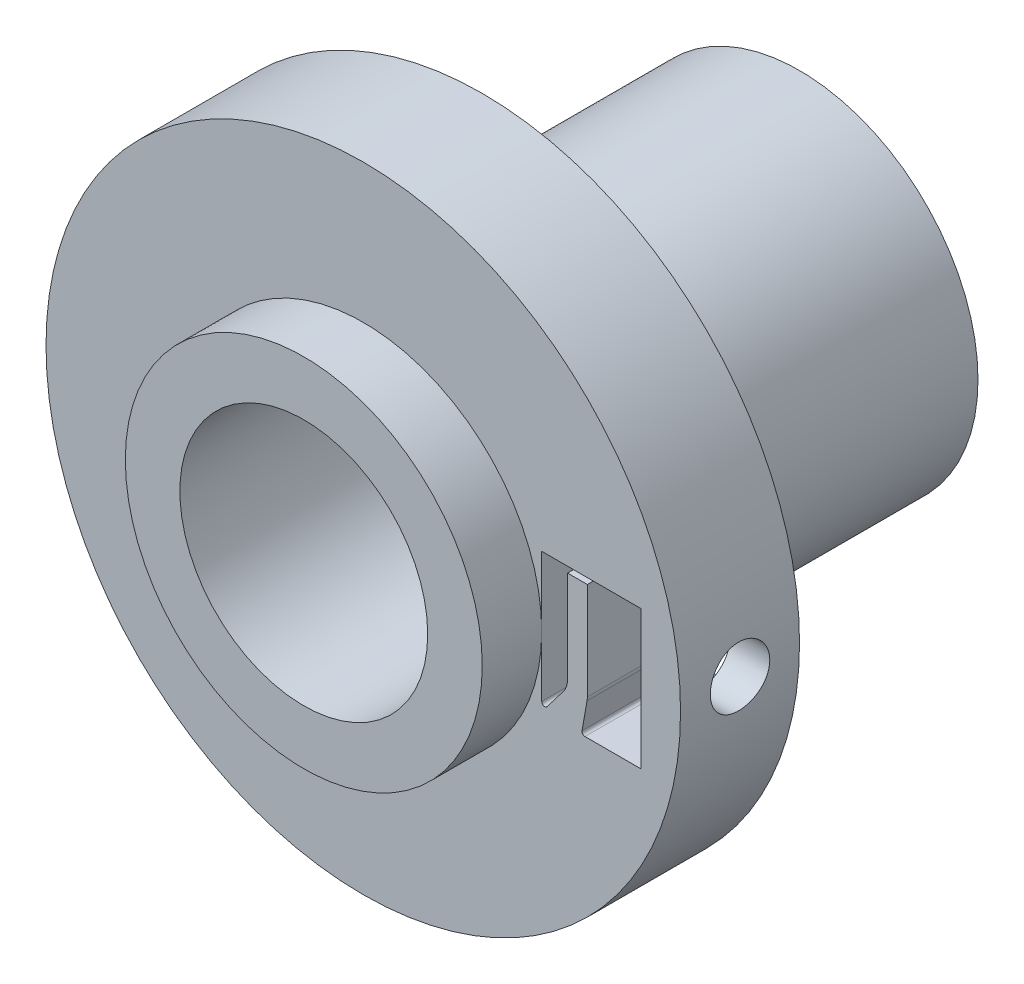
ISO-10303-21;
HEADER;
FILE_DESCRIPTION(('STEP AP214'),'2;1');
FILE_NAME('part.step','',(''),(''),'','','');
FILE_SCHEMA(('AUTOMOTIVE_DESIGN { 1 0 10303 214 1 1 1 1 }'));
ENDSEC;
DATA;
#1=APPLICATION_CONTEXT('core data for automotive mechanical design processes');
#2=APPLICATION_PROTOCOL_DEFINITION('international standard','automotive_design',2000,#1);
#3=PRODUCT_CONTEXT('',#1,'mechanical');
#4=PRODUCT('Part','Part','',(#3));
#5=PRODUCT_RELATED_PRODUCT_CATEGORY('part','',(#4));
#6=PRODUCT_DEFINITION_FORMATION('','',#4);
#7=PRODUCT_DEFINITION_CONTEXT('part definition',#1,'design');
#8=PRODUCT_DEFINITION('design','',#6,#7);
#9=PRODUCT_DEFINITION_SHAPE('','',#8);
#10=(LENGTH_UNIT() NAMED_UNIT(*) SI_UNIT(.MILLI.,.METRE.));
#11=(NAMED_UNIT(*) PLANE_ANGLE_UNIT() SI_UNIT($,.RADIAN.));
#12=(NAMED_UNIT(*) SI_UNIT($,.STERADIAN.) SOLID_ANGLE_UNIT());
#13=UNCERTAINTY_MEASURE_WITH_UNIT(LENGTH_MEASURE(1.E-05),#10,'distance_accuracy_value','');
#14=(GEOMETRIC_REPRESENTATION_CONTEXT(3) GLOBAL_UNCERTAINTY_ASSIGNED_CONTEXT((#13)) GLOBAL_UNIT_ASSIGNED_CONTEXT((#10,
#11,#12)) REPRESENTATION_CONTEXT('',''));
#15=CARTESIAN_POINT('',(0.,0.,0.));
#16=DIRECTION('',(0.,0.,1.));
#17=DIRECTION('',(1.,0.,0.));
#18=AXIS2_PLACEMENT_3D('',#15,#16,#17);
#19=CARTESIAN_POINT('',(0.,0.,-8.));
#20=DIRECTION('',(0.,0.,1.));
#21=DIRECTION('',(1.,0.,0.));
#22=AXIS2_PLACEMENT_3D('',#19,#20,#21);
#23=PLANE('',#22);
#24=CARTESIAN_POINT('',(0.,0.,-8.));
#25=DIRECTION('',(0.,0.,1.));
#26=DIRECTION('',(1.,0.,0.));
#27=AXIS2_PLACEMENT_3D('',#24,#25,#26);
#28=CIRCLE('',#27,9.);
#29=CARTESIAN_POINT('',(9.,0.,-8.));
#30=VERTEX_POINT('',#29);
#31=EDGE_CURVE('E246',#30,#30,#28,.T.);
#32=ORIENTED_EDGE('',*,*,#31,.F.);
#33=EDGE_LOOP('',(#32));
#34=FACE_BOUND('',#33,.T.);
#35=CARTESIAN_POINT('',(0.,0.,-8.));
#36=DIRECTION('',(0.,0.,1.));
#37=DIRECTION('',(1.,0.,0.));
#38=AXIS2_PLACEMENT_3D('',#35,#36,#37);
#39=CIRCLE('',#38,6.25);
#40=CARTESIAN_POINT('',(6.25,0.,-8.));
#41=VERTEX_POINT('',#40);
#42=EDGE_CURVE('E241',#41,#41,#39,.T.);
#43=ORIENTED_EDGE('',*,*,#42,.T.);
#44=EDGE_LOOP('',(#43));
#45=FACE_BOUND('',#44,.T.);
#46=ADVANCED_FACE('F33',(#34,#45),#23,.F.);
#47=CARTESIAN_POINT('',(0.,0.,8.));
#48=DIRECTION('',(0.,0.,-1.));
#49=DIRECTION('',(-1.,0.,0.));
#50=AXIS2_PLACEMENT_3D('',#47,#48,#49);
#51=CYLINDRICAL_SURFACE('',#50,9.);
#52=CARTESIAN_POINT('',(0.,0.,8.));
#53=DIRECTION('',(0.,0.,1.));
#54=DIRECTION('',(1.,0.,0.));
#55=AXIS2_PLACEMENT_3D('',#52,#53,#54);
#56=CIRCLE('',#55,9.);
#57=CARTESIAN_POINT('',(9.,0.,8.));
#58=VERTEX_POINT('',#57);
#59=EDGE_CURVE('E247',#58,#58,#56,.T.);
#60=ORIENTED_EDGE('',*,*,#59,.F.);
#61=EDGE_LOOP('',(#60));
#62=FACE_BOUND('',#61,.T.);
#63=ORIENTED_EDGE('',*,*,#31,.T.);
#64=EDGE_LOOP('',(#63));
#65=FACE_BOUND('',#64,.T.);
#66=ADVANCED_FACE('F294',(#62,#65),#51,.T.);
#67=CARTESIAN_POINT('',(0.,0.,8.));
#68=DIRECTION('',(0.,0.,-1.));
#69=DIRECTION('',(-1.,0.,0.));
#70=AXIS2_PLACEMENT_3D('',#67,#68,#69);
#71=CYLINDRICAL_SURFACE('',#70,6.25);
#72=ORIENTED_EDGE('',*,*,#42,.F.);
#73=EDGE_LOOP('',(#72));
#74=FACE_BOUND('',#73,.T.);
#75=CARTESIAN_POINT('',(0.,0.,17.));
#76=DIRECTION('',(0.,0.,1.));
#77=DIRECTION('',(1.,0.,0.));
#78=AXIS2_PLACEMENT_3D('',#75,#76,#77);
#79=CIRCLE('',#78,6.25);
#80=CARTESIAN_POINT('',(6.25,0.,17.));
#81=VERTEX_POINT('',#80);
#82=EDGE_CURVE('E371',#81,#81,#79,.T.);
#83=ORIENTED_EDGE('',*,*,#82,.T.);
#84=EDGE_LOOP('',(#83));
#85=FACE_BOUND('',#84,.T.);
#86=ADVANCED_FACE('F300',(#74,#85),#71,.F.);
#87=CARTESIAN_POINT('',(0.,0.,14.));
#88=DIRECTION('',(0.,0.,1.));
#89=DIRECTION('',(1.,0.,0.));
#90=AXIS2_PLACEMENT_3D('',#87,#88,#89);
#91=PLANE('',#90);
#92=DIRECTION('',(-0.607450107570798,-0.794357832977196,0.));
#93=VECTOR('',#92,1.);
#94=CARTESIAN_POINT('',(9.,-3.5,14.));
#95=LINE('',#94,#93);
#96=CARTESIAN_POINT('',(10.0943578329772,-2.0689166799529,14.));
#97=VERTEX_POINT('',#96);
#98=CARTESIAN_POINT('',(9.26915367494658,-3.14802980968524,14.));
#99=VERTEX_POINT('',#98);
#100=EDGE_CURVE('E191',#97,#99,#95,.T.);
#101=ORIENTED_EDGE('',*,*,#100,.T.);
#102=CARTESIAN_POINT('',(9.15,-3.05691229354962,14.));
#103=DIRECTION('',(0.,0.,1.));
#104=DIRECTION('',(1.,0.,0.));
#105=AXIS2_PLACEMENT_3D('',#102,#103,#104);
#106=CIRCLE('',#105,0.15);
#107=CARTESIAN_POINT('',(9.,-3.05691229354962,14.));
#108=VERTEX_POINT('',#107);
#109=EDGE_CURVE('E142',#99,#108,#106,.F.);
#110=ORIENTED_EDGE('',*,*,#109,.T.);
#111=DIRECTION('',(0.,1.,0.));
#112=VECTOR('',#111,1.);
#113=CARTESIAN_POINT('',(9.,3.5,14.));
#114=LINE('',#113,#112);
#115=CARTESIAN_POINT('',(9.,0.,14.));
#116=VERTEX_POINT('',#115);
#117=EDGE_CURVE('E134',#108,#116,#114,.T.);
#118=ORIENTED_EDGE('',*,*,#117,.T.);
#119=CARTESIAN_POINT('',(0.,0.,14.));
#120=DIRECTION('',(0.,0.,1.));
#121=DIRECTION('',(1.,0.,0.));
#122=AXIS2_PLACEMENT_3D('',#119,#120,#121);
#123=CIRCLE('',#122,9.);
#124=EDGE_CURVE('E140',#116,#116,#123,.T.);
#125=ORIENTED_EDGE('',*,*,#124,.F.);
#126=CARTESIAN_POINT('',(9.,3.5,14.));
#127=VERTEX_POINT('',#126);
#128=EDGE_CURVE('E147',#116,#127,#114,.T.);
#129=ORIENTED_EDGE('',*,*,#128,.T.);
#130=DIRECTION('',(1.,0.,0.));
#131=VECTOR('',#130,1.);
#132=CARTESIAN_POINT('',(14.,3.5,14.));
#133=LINE('',#132,#131);
#134=CARTESIAN_POINT('',(14.,3.5,14.));
#135=VERTEX_POINT('',#134);
#136=EDGE_CURVE('E146',#127,#135,#133,.T.);
#137=ORIENTED_EDGE('',*,*,#136,.T.);
#138=DIRECTION('',(0.,-1.,0.));
#139=VECTOR('',#138,1.);
#140=CARTESIAN_POINT('',(14.,3.5,14.));
#141=LINE('',#140,#139);
#142=CARTESIAN_POINT('',(14.,-3.5,14.));
#143=VERTEX_POINT('',#142);
#144=EDGE_CURVE('E169',#135,#143,#141,.T.);
#145=ORIENTED_EDGE('',*,*,#144,.T.);
#146=DIRECTION('',(-1.,0.,0.));
#147=VECTOR('',#146,1.);
#148=CARTESIAN_POINT('',(14.,-3.5,14.));
#149=LINE('',#148,#147);
#150=CARTESIAN_POINT('',(11.1787883220732,-3.5,14.));
#151=VERTEX_POINT('',#150);
#152=EDGE_CURVE('E172',#143,#151,#149,.T.);
#153=ORIENTED_EDGE('',*,*,#152,.T.);
#154=CARTESIAN_POINT('',(11.1787883220732,-3.35,14.));
#155=DIRECTION('',(0.,0.,1.));
#156=DIRECTION('',(1.,0.,0.));
#157=AXIS2_PLACEMENT_3D('',#154,#155,#156);
#158=CIRCLE('',#157,0.15);
#159=CARTESIAN_POINT('',(11.0310707882505,-3.32393219991364,14.));
#160=VERTEX_POINT('',#159);
#161=EDGE_CURVE('E11',#151,#160,#158,.F.);
#162=ORIENTED_EDGE('',*,*,#161,.T.);
#163=DIRECTION('',(0.173785333909048,0.984783558817937,0.));
#164=VECTOR('',#163,1.);
#165=CARTESIAN_POINT('',(11.2847835588179,-1.8862265000317,14.));
#166=LINE('',#165,#164);
#167=CARTESIAN_POINT('',(11.2847835588179,-1.8862265000317,14.));
#168=VERTEX_POINT('',#167);
#169=EDGE_CURVE('E174',#160,#168,#166,.T.);
#170=ORIENTED_EDGE('',*,*,#169,.T.);
#171=CARTESIAN_POINT('',(10.3,-1.71244116612265,14.));
#172=DIRECTION('',(0.,0.,1.));
#173=DIRECTION('',(-1.,0.,0.));
#174=AXIS2_PLACEMENT_3D('',#171,#172,#173);
#175=CIRCLE('',#174,0.999999999999999);
#176=CARTESIAN_POINT('',(11.3,-1.71244116612265,14.));
#177=VERTEX_POINT('',#176);
#178=EDGE_CURVE('E176',#168,#177,#175,.T.);
#179=ORIENTED_EDGE('',*,*,#178,.T.);
#180=DIRECTION('',(0.,1.,0.));
#181=VECTOR('',#180,1.);
#182=CARTESIAN_POINT('',(11.3,3.20000000000001,14.));
#183=LINE('',#182,#181);
#184=CARTESIAN_POINT('',(11.3,3.20000000000001,14.));
#185=VERTEX_POINT('',#184);
#186=EDGE_CURVE('E179',#177,#185,#183,.T.);
#187=ORIENTED_EDGE('',*,*,#186,.T.);
#188=DIRECTION('',(-1.,0.,0.));
#189=VECTOR('',#188,1.);
#190=CARTESIAN_POINT('',(10.3,3.20000000000001,14.));
#191=LINE('',#190,#189);
#192=CARTESIAN_POINT('',(10.3,3.20000000000001,14.));
#193=VERTEX_POINT('',#192);
#194=EDGE_CURVE('E182',#185,#193,#191,.T.);
#195=ORIENTED_EDGE('',*,*,#194,.T.);
#196=DIRECTION('',(0.,-1.,0.));
#197=VECTOR('',#196,1.);
#198=CARTESIAN_POINT('',(10.3,-1.4614665723821,14.));
#199=LINE('',#198,#197);
#200=CARTESIAN_POINT('',(10.3,-1.4614665723821,14.));
#201=VERTEX_POINT('',#200);
#202=EDGE_CURVE('E185',#193,#201,#199,.T.);
#203=ORIENTED_EDGE('',*,*,#202,.T.);
#204=CARTESIAN_POINT('',(9.3,-1.4614665723821,14.));
#205=DIRECTION('',(0.,0.,-1.));
#206=DIRECTION('',(1.,0.,0.));
#207=AXIS2_PLACEMENT_3D('',#204,#205,#206);
#208=CIRCLE('',#207,1.);
#209=EDGE_CURVE('E188',#201,#97,#208,.T.);
#210=ORIENTED_EDGE('',*,*,#209,.T.);
#211=EDGE_LOOP('',(#101,#110,#118,#125,#129,#137,#145,#153,#162,#170,#179,#187,#195,#203,#210));
#212=FACE_BOUND('',#211,.T.);
#213=CARTESIAN_POINT('',(0.,0.,14.));
#214=DIRECTION('',(0.,0.,1.));
#215=DIRECTION('',(1.,0.,0.));
#216=AXIS2_PLACEMENT_3D('',#213,#214,#215);
#217=CIRCLE('',#216,16.);
#218=CARTESIAN_POINT('',(16.,0.,14.));
#219=VERTEX_POINT('',#218);
#220=EDGE_CURVE('E238',#219,#219,#217,.T.);
#221=ORIENTED_EDGE('',*,*,#220,.T.);
#222=EDGE_LOOP('',(#221));
#223=FACE_BOUND('',#222,.T.);
#224=ADVANCED_FACE('F137',(#212,#223),#91,.T.);
#225=CARTESIAN_POINT('',(0.,0.,8.));
#226=DIRECTION('',(0.,0.,1.));
#227=DIRECTION('',(1.,0.,0.));
#228=AXIS2_PLACEMENT_3D('',#225,#226,#227);
#229=PLANE('',#228);
#230=DIRECTION('',(1.,0.,0.));
#231=VECTOR('',#230,1.);
#232=CARTESIAN_POINT('',(14.,3.5,8.));
#233=LINE('',#232,#231);
#234=CARTESIAN_POINT('',(9.,3.5,8.));
#235=VERTEX_POINT('',#234);
#236=CARTESIAN_POINT('',(14.,3.5,8.));
#237=VERTEX_POINT('',#236);
#238=EDGE_CURVE('E195',#235,#237,#233,.T.);
#239=ORIENTED_EDGE('',*,*,#238,.F.);
#240=DIRECTION('',(0.,-1.,0.));
#241=VECTOR('',#240,1.);
#242=CARTESIAN_POINT('',(9.,0.,8.));
#243=LINE('',#242,#241);
#244=EDGE_CURVE('E250',#235,#58,#243,.T.);
#245=ORIENTED_EDGE('',*,*,#244,.T.);
#246=ORIENTED_EDGE('',*,*,#59,.T.);
#247=DIRECTION('',(0.,1.,0.));
#248=VECTOR('',#247,1.);
#249=CARTESIAN_POINT('',(9.,3.5,8.));
#250=LINE('',#249,#248);
#251=CARTESIAN_POINT('',(9.,-3.05691229354962,8.));
#252=VERTEX_POINT('',#251);
#253=EDGE_CURVE('E193',#252,#58,#250,.T.);
#254=ORIENTED_EDGE('',*,*,#253,.F.);
#255=CARTESIAN_POINT('',(9.15,-3.05691229354962,8.));
#256=DIRECTION('',(0.,0.,1.));
#257=DIRECTION('',(1.,0.,0.));
#258=AXIS2_PLACEMENT_3D('',#255,#256,#257);
#259=CIRCLE('',#258,0.15);
#260=CARTESIAN_POINT('',(9.26915367494658,-3.14802980968524,8.));
#261=VERTEX_POINT('',#260);
#262=EDGE_CURVE('E263',#252,#261,#259,.T.);
#263=ORIENTED_EDGE('',*,*,#262,.T.);
#264=DIRECTION('',(-0.607450107570798,-0.794357832977196,0.));
#265=VECTOR('',#264,1.);
#266=CARTESIAN_POINT('',(9.,-3.5,8.));
#267=LINE('',#266,#265);
#268=CARTESIAN_POINT('',(10.0943578329772,-2.0689166799529,8.));
#269=VERTEX_POINT('',#268);
#270=EDGE_CURVE('E155',#269,#261,#267,.T.);
#271=ORIENTED_EDGE('',*,*,#270,.F.);
#272=CARTESIAN_POINT('',(9.3,-1.4614665723821,8.));
#273=DIRECTION('',(0.,0.,-1.));
#274=DIRECTION('',(1.,0.,0.));
#275=AXIS2_PLACEMENT_3D('',#272,#273,#274);
#276=CIRCLE('',#275,1.);
#277=CARTESIAN_POINT('',(10.3,-1.4614665723821,8.));
#278=VERTEX_POINT('',#277);
#279=EDGE_CURVE('E157',#278,#269,#276,.T.);
#280=ORIENTED_EDGE('',*,*,#279,.F.);
#281=DIRECTION('',(0.,-1.,0.));
#282=VECTOR('',#281,1.);
#283=CARTESIAN_POINT('',(10.3,-1.4614665723821,8.));
#284=LINE('',#283,#282);
#285=CARTESIAN_POINT('',(10.3,3.20000000000001,8.));
#286=VERTEX_POINT('',#285);
#287=EDGE_CURVE('E214',#286,#278,#284,.T.);
#288=ORIENTED_EDGE('',*,*,#287,.F.);
#289=DIRECTION('',(-1.,0.,0.));
#290=VECTOR('',#289,1.);
#291=CARTESIAN_POINT('',(10.3,3.20000000000001,8.));
#292=LINE('',#291,#290);
#293=CARTESIAN_POINT('',(11.3,3.20000000000001,8.));
#294=VERTEX_POINT('',#293);
#295=EDGE_CURVE('E211',#294,#286,#292,.T.);
#296=ORIENTED_EDGE('',*,*,#295,.F.);
#297=DIRECTION('',(0.,1.,0.));
#298=VECTOR('',#297,1.);
#299=CARTESIAN_POINT('',(11.3,3.20000000000001,8.));
#300=LINE('',#299,#298);
#301=CARTESIAN_POINT('',(11.3,-1.71244116612265,8.));
#302=VERTEX_POINT('',#301);
#303=EDGE_CURVE('E208',#302,#294,#300,.T.);
#304=ORIENTED_EDGE('',*,*,#303,.F.);
#305=CARTESIAN_POINT('',(10.3,-1.71244116612265,8.));
#306=DIRECTION('',(0.,0.,1.));
#307=DIRECTION('',(-1.,0.,0.));
#308=AXIS2_PLACEMENT_3D('',#305,#306,#307);
#309=CIRCLE('',#308,0.999999999999999);
#310=CARTESIAN_POINT('',(11.2847835588179,-1.8862265000317,8.));
#311=VERTEX_POINT('',#310);
#312=EDGE_CURVE('E205',#311,#302,#309,.T.);
#313=ORIENTED_EDGE('',*,*,#312,.F.);
#314=DIRECTION('',(0.173785333909048,0.984783558817937,0.));
#315=VECTOR('',#314,1.);
#316=CARTESIAN_POINT('',(11.2847835588179,-1.8862265000317,8.));
#317=LINE('',#316,#315);
#318=CARTESIAN_POINT('',(11.0310707882505,-3.32393219991364,8.));
#319=VERTEX_POINT('',#318);
#320=EDGE_CURVE('E203',#319,#311,#317,.T.);
#321=ORIENTED_EDGE('',*,*,#320,.F.);
#322=CARTESIAN_POINT('',(11.1787883220732,-3.35,8.));
#323=DIRECTION('',(0.,0.,1.));
#324=DIRECTION('',(1.,0.,0.));
#325=AXIS2_PLACEMENT_3D('',#322,#323,#324);
#326=CIRCLE('',#325,0.15);
#327=CARTESIAN_POINT('',(11.1787883220732,-3.5,8.));
#328=VERTEX_POINT('',#327);
#329=EDGE_CURVE('E41',#319,#328,#326,.T.);
#330=ORIENTED_EDGE('',*,*,#329,.T.);
#331=DIRECTION('',(-1.,0.,0.));
#332=VECTOR('',#331,1.);
#333=CARTESIAN_POINT('',(14.,-3.5,8.));
#334=LINE('',#333,#332);
#335=CARTESIAN_POINT('',(14.,-3.5,8.));
#336=VERTEX_POINT('',#335);
#337=EDGE_CURVE('E201',#336,#328,#334,.T.);
#338=ORIENTED_EDGE('',*,*,#337,.F.);
#339=DIRECTION('',(0.,-1.,0.));
#340=VECTOR('',#339,1.);
#341=CARTESIAN_POINT('',(14.,3.5,8.));
#342=LINE('',#341,#340);
#343=EDGE_CURVE('E198',#237,#336,#342,.T.);
#344=ORIENTED_EDGE('',*,*,#343,.F.);
#345=EDGE_LOOP('',(#239,#245,#246,#254,#263,#271,#280,#288,#296,#304,#313,#321,#330,#338,#344));
#346=FACE_BOUND('',#345,.T.);
#347=CARTESIAN_POINT('',(0.,0.,8.));
#348=DIRECTION('',(0.,0.,1.));
#349=DIRECTION('',(1.,0.,0.));
#350=AXIS2_PLACEMENT_3D('',#347,#348,#349);
#351=CIRCLE('',#350,16.);
#352=CARTESIAN_POINT('',(16.,0.,8.));
#353=VERTEX_POINT('',#352);
#354=EDGE_CURVE('E221',#353,#353,#351,.T.);
#355=ORIENTED_EDGE('',*,*,#354,.F.);
#356=EDGE_LOOP('',(#355));
#357=FACE_BOUND('',#356,.T.);
#358=ADVANCED_FACE('F278',(#346,#357),#229,.F.);
#359=CARTESIAN_POINT('',(0.,0.,14.));
#360=DIRECTION('',(0.,0.,-1.));
#361=DIRECTION('',(-1.,0.,0.));
#362=AXIS2_PLACEMENT_3D('',#359,#360,#361);
#363=CYLINDRICAL_SURFACE('',#362,16.);
#364=CARTESIAN_POINT('',(16.,0.,9.49999999999999));
#365=CARTESIAN_POINT('',(15.9999990874377,-0.0840576996574436,9.50000365297454));
#366=CARTESIAN_POINT('',(15.9993305431474,-0.168171627589379,9.50708947712899));
#367=CARTESIAN_POINT('',(15.9967278705616,-0.334069380755584,9.53525029986667));
#368=CARTESIAN_POINT('',(15.9947923323258,-0.41585050405935,9.5563408836487));
#369=CARTESIAN_POINT('',(15.9898742536092,-0.574656127608676,9.61189348015233));
#370=CARTESIAN_POINT('',(15.9868923297887,-0.65168339804474,9.64634761866461));
#371=CARTESIAN_POINT('',(15.9802152971296,-0.798844080486045,9.72763447702507));
#372=CARTESIAN_POINT('',(15.9765203343939,-0.868978900331676,9.77446466172327));
#373=CARTESIAN_POINT('',(15.9688182603974,-1.00060451358299,9.87933459825466));
#374=CARTESIAN_POINT('',(15.9648102960756,-1.06207030524922,9.93740567079617));
#375=CARTESIAN_POINT('',(15.9569410358395,-1.17439832001845,10.0630423573301));
#376=CARTESIAN_POINT('',(15.9530797465779,-1.22526006263066,10.1306084013267));
#377=CARTESIAN_POINT('',(15.9459321531903,-1.31502335742932,10.2734717482233));
#378=CARTESIAN_POINT('',(15.9426469303983,-1.35390251855919,10.348783178514));
#379=CARTESIAN_POINT('',(15.9370337331836,-1.41845402355083,10.5049013311272));
#380=CARTESIAN_POINT('',(15.9347057377932,-1.44412665669788,10.5857079330355));
#381=CARTESIAN_POINT('',(15.9312781055131,-1.48146280171703,10.7502691883138));
#382=CARTESIAN_POINT('',(15.9301748556596,-1.49316752621389,10.8340144147356));
#383=CARTESIAN_POINT('',(15.9293103424401,-1.50236296529023,11.0022874652902));
#384=CARTESIAN_POINT('',(15.9295490478042,-1.49985401107327,11.0868152711418));
#385=CARTESIAN_POINT('',(15.9313381803757,-1.48072731632193,11.2539706157215));
#386=CARTESIAN_POINT('',(15.9328844316596,-1.46415449112824,11.3366033448381));
#387=CARTESIAN_POINT('',(15.9371079001961,-1.41744034122964,11.497909220756));
#388=CARTESIAN_POINT('',(15.9397851310565,-1.3872988532664,11.5765823199022));
#389=CARTESIAN_POINT('',(15.9459737103685,-1.3142531244971,11.727878077872));
#390=CARTESIAN_POINT('',(15.9494863652322,-1.27132886758545,11.8004910172943));
#391=CARTESIAN_POINT('',(15.9569488633928,-1.17395046357292,11.9374989115113));
#392=CARTESIAN_POINT('',(15.9608987179246,-1.11949602014408,12.0018936550287));
#393=CARTESIAN_POINT('',(15.9688091656293,-1.0003517239972,12.1208982908966));
#394=CARTESIAN_POINT('',(15.9727697411833,-0.935623065481643,12.1754693406234));
#395=CARTESIAN_POINT('',(15.980240887844,-0.797902747560454,12.2729767493523));
#396=CARTESIAN_POINT('',(15.9837514585342,-0.724911080506019,12.3159130975843));
#397=CARTESIAN_POINT('',(15.9899280035071,-0.572710457840158,12.388930399422));
#398=CARTESIAN_POINT('',(15.9925938548147,-0.493500599071183,12.4190094814773));
#399=CARTESIAN_POINT('',(15.9967792828423,-0.331124322273424,12.4654304536089));
#400=CARTESIAN_POINT('',(15.9982988896806,-0.247958008264099,12.4817727046306));
#401=CARTESIAN_POINT('',(16.0000167439267,-0.0803661051891794,12.5002070701882));
#402=CARTESIAN_POINT('',(16.0002199632847,0.00405353705355381,12.5023528051343));
#403=CARTESIAN_POINT('',(15.9992954563897,0.17205127843741,12.4924739167253));
#404=CARTESIAN_POINT('',(15.9981677459063,0.255629387537639,12.4804494612663));
#405=CARTESIAN_POINT('',(15.9947113308173,0.419417565662278,12.4426159901192));
#406=CARTESIAN_POINT('',(15.9923848051808,0.499633460781155,12.4168319808046));
#407=CARTESIAN_POINT('',(15.9867919001555,0.654601026064808,12.3522369510549));
#408=CARTESIAN_POINT('',(15.9835255021299,0.72935258783897,12.3134256722958));
#409=CARTESIAN_POINT('',(15.9764061412804,0.871512627170615,12.2237441338324));
#410=CARTESIAN_POINT('',(15.9725514712721,0.938898720136997,12.1728385285295));
#411=CARTESIAN_POINT('',(15.9646938863657,1.06418863953513,12.0604641893156));
#412=CARTESIAN_POINT('',(15.9606909682048,1.12209225711382,11.998995222806));
#413=CARTESIAN_POINT('',(15.9529731744665,1.22695884240091,11.8670055812055));
#414=CARTESIAN_POINT('',(15.9492592480101,1.27388669789138,11.7964569459727));
#415=CARTESIAN_POINT('',(15.9425540145368,1.35522852111171,11.6484489904856));
#416=CARTESIAN_POINT('',(15.9395626986821,1.38964264189422,11.5709897547677));
#417=CARTESIAN_POINT('',(15.9346470864828,1.44492091464444,11.411481345012));
#418=CARTESIAN_POINT('',(15.9327211269093,1.46580619653948,11.3294395470036));
#419=CARTESIAN_POINT('',(15.9301489811257,1.49350258954047,11.1629947213508));
#420=CARTESIAN_POINT('',(15.9295027630406,1.50031405119065,11.0785917525705));
#421=CARTESIAN_POINT('',(15.929563861851,1.49966491440228,10.9101694388341));
#422=CARTESIAN_POINT('',(15.930265947437,1.49225947642594,10.8261498739104));
#423=CARTESIAN_POINT('',(15.9329334080922,1.46350215815381,10.6605537598966));
#424=CARTESIAN_POINT('',(15.9348987847997,1.44215025977346,10.5789772139744));
#425=CARTESIAN_POINT('',(15.9398699587172,1.38612086380733,10.4205816575547));
#426=CARTESIAN_POINT('',(15.9428756482903,1.35144474478351,10.3437621558342));
#427=CARTESIAN_POINT('',(15.9495889947787,1.26975707915473,10.1970253859609));
#428=CARTESIAN_POINT('',(15.9532966449687,1.22274565072801,10.127108051691));
#429=CARTESIAN_POINT('',(15.9610133498176,1.1175144922873,9.9958776803139));
#430=CARTESIAN_POINT('',(15.9650234741094,1.05925372920377,9.93459760928345));
#431=CARTESIAN_POINT('',(15.97288349636,0.933256833294971,9.82265816583139));
#432=CARTESIAN_POINT('',(15.9767333555577,0.865518425328444,9.77200135087676));
#433=CARTESIAN_POINT('',(15.9838478838907,0.72232503234334,9.68265914281074));
#434=CARTESIAN_POINT('',(15.9871112141985,0.646852995234789,9.64400099570282));
#435=CARTESIAN_POINT('',(15.9926700583075,0.490507906890441,9.57995682073443));
#436=CARTESIAN_POINT('',(15.9949666711945,0.409641110987893,9.55455571267651));
#437=CARTESIAN_POINT('',(15.997751278192,0.27359062604344,9.52413424804104));
#438=CARTESIAN_POINT('',(15.9985906537126,0.219278798513778,9.5150961367273));
#439=CARTESIAN_POINT('',(15.9997153122197,0.109986004796567,9.5030278280725));
#440=CARTESIAN_POINT('',(16.0000005971556,0.0550050409638891,9.49999760959417));
#441=CARTESIAN_POINT('',(16.,0.,9.49999999999999));
#442=B_SPLINE_CURVE_WITH_KNOTS('',3,(#364,#365,#366,#367,#368,#369,#370,#371,#372,#373,#374,
#375,#376,#377,#378,#379,#380,#381,#382,#383,#384,#385,#386,#387,#388,#389,#390,#391,#392,#393,
#394,#395,#396,#397,#398,#399,#400,#401,#402,#403,#404,#405,#406,#407,#408,#409,#410,#411,#412,
#413,#414,#415,#416,#417,#418,#419,#420,#421,#422,#423,#424,#425,#426,#427,#428,#429,#430,#431,
#432,#433,#434,#435,#436,#437,#438,#439,#440,#441),.UNSPECIFIED.,.T.,.F.,(4,2,2,2,2,2,2,2,2,2,2,
2,2,2,2,2,2,2,2,2,2,2,2,2,2,2,2,2,2,2,2,2,2,2,2,2,2,2,4),(0.,0.251972252870636,
0.504225384091021,0.756330105411321,1.00838322474624,1.26114902549997,1.51392627709208,
1.7671730523228,2.02041428001783,2.27290645171287,2.52539273992279,2.77707569221288,
3.02876167283652,3.28084385105098,3.53293250861135,3.78599701442564,4.03906175449558,
4.29216331905138,4.54525823296865,4.79739665595727,5.04953209150326,5.30121085328535,
5.55289460601788,5.80532315252836,6.05775725807136,6.31098819719603,6.5642160390067,
6.81704741885483,7.06987250121942,7.32171862414044,7.57356507363442,7.82538547338787,
8.0772034606682,8.32995794997955,8.58277321830876,8.83615843702519,9.08925479233283,
9.25413906717823,9.41902276191881),.UNSPECIFIED.);
#443=CARTESIAN_POINT('',(16.,0.,9.49999999999999));
#444=VERTEX_POINT('',#443);
#445=EDGE_CURVE('E161',#444,#444,#442,.T.);
#446=ORIENTED_EDGE('',*,*,#445,.T.);
#447=EDGE_LOOP('',(#446));
#448=FACE_BOUND('',#447,.T.);
#449=ORIENTED_EDGE('',*,*,#220,.F.);
#450=EDGE_LOOP('',(#449));
#451=FACE_BOUND('',#450,.T.);
#452=ORIENTED_EDGE('',*,*,#354,.T.);
#453=EDGE_LOOP('',(#452));
#454=FACE_BOUND('',#453,.T.);
#455=ADVANCED_FACE('F308',(#448,#451,#454),#363,.T.);
#456=CARTESIAN_POINT('',(9.,3.5,14.));
#457=DIRECTION('',(-1.,0.,0.));
#458=DIRECTION('',(0.,-1.,0.));
#459=AXIS2_PLACEMENT_3D('',#456,#457,#458);
#460=PLANE('',#459);
#461=ORIENTED_EDGE('',*,*,#117,.F.);
#462=DIRECTION('',(0.,0.,-1.));
#463=VECTOR('',#462,1.);
#464=CARTESIAN_POINT('',(9.,-3.05691229354962,8.));
#465=LINE('',#464,#463);
#466=EDGE_CURVE('E255',#108,#252,#465,.T.);
#467=ORIENTED_EDGE('',*,*,#466,.T.);
#468=ORIENTED_EDGE('',*,*,#253,.T.);
#469=ORIENTED_EDGE('',*,*,#244,.F.);
#470=DIRECTION('',(0.,0.,-1.));
#471=VECTOR('',#470,1.);
#472=CARTESIAN_POINT('',(9.,3.5,14.));
#473=LINE('',#472,#471);
#474=EDGE_CURVE('E152',#127,#235,#473,.T.);
#475=ORIENTED_EDGE('',*,*,#474,.F.);
#476=ORIENTED_EDGE('',*,*,#128,.F.);
#477=EDGE_LOOP('',(#461,#467,#468,#469,#475,#476));
#478=FACE_BOUND('',#477,.T.);
#479=ADVANCED_FACE('F150',(#478),#460,.F.);
#480=CARTESIAN_POINT('',(9.,-3.5,14.));
#481=DIRECTION('',(0.794357832977196,-0.607450107570798,0.));
#482=DIRECTION('',(0.607450107570798,0.794357832977196,0.));
#483=AXIS2_PLACEMENT_3D('',#480,#481,#482);
#484=PLANE('',#483);
#485=ORIENTED_EDGE('',*,*,#270,.T.);
#486=DIRECTION('',(0.,0.,-1.));
#487=VECTOR('',#486,1.);
#488=CARTESIAN_POINT('',(9.26915367494658,-3.14802980968524,14.));
#489=LINE('',#488,#487);
#490=EDGE_CURVE('E261',#261,#99,#489,.F.);
#491=ORIENTED_EDGE('',*,*,#490,.T.);
#492=ORIENTED_EDGE('',*,*,#100,.F.);
#493=DIRECTION('',(0.,0.,-1.));
#494=VECTOR('',#493,1.);
#495=CARTESIAN_POINT('',(10.0943578329772,-2.0689166799529,14.));
#496=LINE('',#495,#494);
#497=EDGE_CURVE('E219',#97,#269,#496,.T.);
#498=ORIENTED_EDGE('',*,*,#497,.T.);
#499=EDGE_LOOP('',(#485,#491,#492,#498));
#500=FACE_BOUND('',#499,.T.);
#501=ADVANCED_FACE('F319',(#500),#484,.F.);
#502=CARTESIAN_POINT('',(9.3,-1.4614665723821,14.));
#503=DIRECTION('',(0.,0.,-1.));
#504=DIRECTION('',(-1.,0.,0.));
#505=AXIS2_PLACEMENT_3D('',#502,#503,#504);
#506=CYLINDRICAL_SURFACE('',#505,1.);
#507=ORIENTED_EDGE('',*,*,#279,.T.);
#508=ORIENTED_EDGE('',*,*,#497,.F.);
#509=ORIENTED_EDGE('',*,*,#209,.F.);
#510=DIRECTION('',(0.,0.,-1.));
#511=VECTOR('',#510,1.);
#512=CARTESIAN_POINT('',(10.3,-1.4614665723821,14.));
#513=LINE('',#512,#511);
#514=EDGE_CURVE('E222',#201,#278,#513,.T.);
#515=ORIENTED_EDGE('',*,*,#514,.T.);
#516=EDGE_LOOP('',(#507,#508,#509,#515));
#517=FACE_BOUND('',#516,.T.);
#518=ADVANCED_FACE('F347',(#517),#506,.F.);
#519=CARTESIAN_POINT('',(10.3,-1.4614665723821,14.));
#520=DIRECTION('',(1.,0.,0.));
#521=DIRECTION('',(0.,1.,0.));
#522=AXIS2_PLACEMENT_3D('',#519,#520,#521);
#523=PLANE('',#522);
#524=ORIENTED_EDGE('',*,*,#287,.T.);
#525=ORIENTED_EDGE('',*,*,#514,.F.);
#526=ORIENTED_EDGE('',*,*,#202,.F.);
#527=DIRECTION('',(0.,0.,-1.));
#528=VECTOR('',#527,1.);
#529=CARTESIAN_POINT('',(10.3,3.20000000000001,14.));
#530=LINE('',#529,#528);
#531=EDGE_CURVE('E224',#193,#286,#530,.T.);
#532=ORIENTED_EDGE('',*,*,#531,.T.);
#533=EDGE_LOOP('',(#524,#525,#526,#532));
#534=FACE_BOUND('',#533,.T.);
#535=ADVANCED_FACE('F343',(#534),#523,.F.);
#536=CARTESIAN_POINT('',(10.3,3.20000000000001,14.));
#537=DIRECTION('',(0.,-1.,0.));
#538=DIRECTION('',(0.,0.,-1.));
#539=AXIS2_PLACEMENT_3D('',#536,#537,#538);
#540=PLANE('',#539);
#541=ORIENTED_EDGE('',*,*,#295,.T.);
#542=ORIENTED_EDGE('',*,*,#531,.F.);
#543=ORIENTED_EDGE('',*,*,#194,.F.);
#544=DIRECTION('',(0.,0.,-1.));
#545=VECTOR('',#544,1.);
#546=CARTESIAN_POINT('',(11.3,3.20000000000001,14.));
#547=LINE('',#546,#545);
#548=EDGE_CURVE('E226',#185,#294,#547,.T.);
#549=ORIENTED_EDGE('',*,*,#548,.T.);
#550=EDGE_LOOP('',(#541,#542,#543,#549));
#551=FACE_BOUND('',#550,.T.);
#552=ADVANCED_FACE('F339',(#551),#540,.F.);
#553=CARTESIAN_POINT('',(11.3,3.20000000000001,14.));
#554=DIRECTION('',(-1.,0.,0.));
#555=DIRECTION('',(0.,-1.,0.));
#556=AXIS2_PLACEMENT_3D('',#553,#554,#555);
#557=PLANE('',#556);
#558=ORIENTED_EDGE('',*,*,#303,.T.);
#559=ORIENTED_EDGE('',*,*,#548,.F.);
#560=ORIENTED_EDGE('',*,*,#186,.F.);
#561=DIRECTION('',(0.,0.,-1.));
#562=VECTOR('',#561,1.);
#563=CARTESIAN_POINT('',(11.3,-1.71244116612265,14.));
#564=LINE('',#563,#562);
#565=EDGE_CURVE('E228',#177,#302,#564,.T.);
#566=ORIENTED_EDGE('',*,*,#565,.T.);
#567=EDGE_LOOP('',(#558,#559,#560,#566));
#568=FACE_BOUND('',#567,.T.);
#569=ADVANCED_FACE('F336',(#568),#557,.F.);
#570=CARTESIAN_POINT('',(10.3,-1.71244116612265,14.));
#571=DIRECTION('',(0.,0.,-1.));
#572=DIRECTION('',(-1.,0.,0.));
#573=AXIS2_PLACEMENT_3D('',#570,#571,#572);
#574=CYLINDRICAL_SURFACE('',#573,0.999999999999999);
#575=ORIENTED_EDGE('',*,*,#312,.T.);
#576=ORIENTED_EDGE('',*,*,#565,.F.);
#577=ORIENTED_EDGE('',*,*,#178,.F.);
#578=DIRECTION('',(0.,0.,-1.));
#579=VECTOR('',#578,1.);
#580=CARTESIAN_POINT('',(11.2847835588179,-1.8862265000317,14.));
#581=LINE('',#580,#579);
#582=EDGE_CURVE('E230',#168,#311,#581,.T.);
#583=ORIENTED_EDGE('',*,*,#582,.T.);
#584=EDGE_LOOP('',(#575,#576,#577,#583));
#585=FACE_BOUND('',#584,.T.);
#586=ADVANCED_FACE('F283',(#585),#574,.T.);
#587=CARTESIAN_POINT('',(11.2847835588179,-1.8862265000317,14.));
#588=DIRECTION('',(-0.984783558817937,0.173785333909048,0.));
#589=DIRECTION('',(-0.173785333909048,-0.984783558817937,0.));
#590=AXIS2_PLACEMENT_3D('',#587,#588,#589);
#591=PLANE('',#590);
#592=ORIENTED_EDGE('',*,*,#169,.F.);
#593=DIRECTION('',(0.,0.,-1.));
#594=VECTOR('',#593,1.);
#595=CARTESIAN_POINT('',(11.0310707882505,-3.32393219991364,8.));
#596=LINE('',#595,#594);
#597=EDGE_CURVE('E266',#160,#319,#596,.T.);
#598=ORIENTED_EDGE('',*,*,#597,.T.);
#599=ORIENTED_EDGE('',*,*,#320,.T.);
#600=ORIENTED_EDGE('',*,*,#582,.F.);
#601=EDGE_LOOP('',(#592,#598,#599,#600));
#602=FACE_BOUND('',#601,.T.);
#603=ADVANCED_FACE('F272',(#602),#591,.F.);
#604=CARTESIAN_POINT('',(14.,-3.5,14.));
#605=DIRECTION('',(0.,-1.,0.));
#606=DIRECTION('',(0.,0.,-1.));
#607=AXIS2_PLACEMENT_3D('',#604,#605,#606);
#608=PLANE('',#607);
#609=ORIENTED_EDGE('',*,*,#337,.T.);
#610=DIRECTION('',(0.,0.,-1.));
#611=VECTOR('',#610,1.);
#612=CARTESIAN_POINT('',(11.1787883220732,-3.5,14.));
#613=LINE('',#612,#611);
#614=EDGE_CURVE('E48',#328,#151,#613,.F.);
#615=ORIENTED_EDGE('',*,*,#614,.T.);
#616=ORIENTED_EDGE('',*,*,#152,.F.);
#617=DIRECTION('',(0.,0.,-1.));
#618=VECTOR('',#617,1.);
#619=CARTESIAN_POINT('',(14.,-3.5,14.));
#620=LINE('',#619,#618);
#621=EDGE_CURVE('E233',#143,#336,#620,.T.);
#622=ORIENTED_EDGE('',*,*,#621,.T.);
#623=EDGE_LOOP('',(#609,#615,#616,#622));
#624=FACE_BOUND('',#623,.T.);
#625=ADVANCED_FACE('F328',(#624),#608,.F.);
#626=CARTESIAN_POINT('',(14.,3.5,14.));
#627=DIRECTION('',(1.,0.,0.));
#628=DIRECTION('',(0.,0.,-1.));
#629=AXIS2_PLACEMENT_3D('',#626,#627,#628);
#630=PLANE('',#629);
#631=CARTESIAN_POINT('',(14.,0.,11.));
#632=DIRECTION('',(1.,0.,0.));
#633=DIRECTION('',(0.,0.,-1.));
#634=AXIS2_PLACEMENT_3D('',#631,#632,#633);
#635=CIRCLE('',#634,1.5);
#636=CARTESIAN_POINT('',(14.,0.,9.49999999999999));
#637=VERTEX_POINT('',#636);
#638=EDGE_CURVE('E256',#637,#637,#635,.T.);
#639=ORIENTED_EDGE('',*,*,#638,.T.);
#640=EDGE_LOOP('',(#639));
#641=FACE_BOUND('',#640,.T.);
#642=ORIENTED_EDGE('',*,*,#343,.T.);
#643=ORIENTED_EDGE('',*,*,#621,.F.);
#644=ORIENTED_EDGE('',*,*,#144,.F.);
#645=DIRECTION('',(0.,0.,-1.));
#646=VECTOR('',#645,1.);
#647=CARTESIAN_POINT('',(14.,3.5,14.));
#648=LINE('',#647,#646);
#649=EDGE_CURVE('E235',#135,#237,#648,.T.);
#650=ORIENTED_EDGE('',*,*,#649,.T.);
#651=EDGE_LOOP('',(#642,#643,#644,#650));
#652=FACE_BOUND('',#651,.T.);
#653=ADVANCED_FACE('F324',(#641,#652),#630,.F.);
#654=CARTESIAN_POINT('',(14.,3.5,14.));
#655=DIRECTION('',(0.,1.,0.));
#656=DIRECTION('',(-1.,0.,0.));
#657=AXIS2_PLACEMENT_3D('',#654,#655,#656);
#658=PLANE('',#657);
#659=ORIENTED_EDGE('',*,*,#238,.T.);
#660=ORIENTED_EDGE('',*,*,#649,.F.);
#661=ORIENTED_EDGE('',*,*,#136,.F.);
#662=ORIENTED_EDGE('',*,*,#474,.T.);
#663=EDGE_LOOP('',(#659,#660,#661,#662));
#664=FACE_BOUND('',#663,.T.);
#665=ADVANCED_FACE('F320',(#664),#658,.F.);
#666=CARTESIAN_POINT('',(13.,0.,11.));
#667=DIRECTION('',(1.,0.,0.));
#668=DIRECTION('',(0.,0.,-1.));
#669=AXIS2_PLACEMENT_3D('',#666,#667,#668);
#670=CYLINDRICAL_SURFACE('',#669,1.5);
#671=ORIENTED_EDGE('',*,*,#638,.F.);
#672=EDGE_LOOP('',(#671));
#673=FACE_BOUND('',#672,.T.);
#674=ORIENTED_EDGE('',*,*,#445,.F.);
#675=EDGE_LOOP('',(#674));
#676=FACE_BOUND('',#675,.T.);
#677=ADVANCED_FACE('F323',(#673,#676),#670,.F.);
#678=CARTESIAN_POINT('',(0.,0.,17.));
#679=DIRECTION('',(0.,0.,1.));
#680=DIRECTION('',(1.,0.,0.));
#681=AXIS2_PLACEMENT_3D('',#678,#679,#680);
#682=PLANE('',#681);
#683=CARTESIAN_POINT('',(0.,0.,17.));
#684=DIRECTION('',(0.,0.,1.));
#685=DIRECTION('',(1.,0.,0.));
#686=AXIS2_PLACEMENT_3D('',#683,#684,#685);
#687=CIRCLE('',#686,9.);
#688=CARTESIAN_POINT('',(9.,0.,17.));
#689=VERTEX_POINT('',#688);
#690=EDGE_CURVE('E259',#689,#689,#687,.T.);
#691=ORIENTED_EDGE('',*,*,#690,.T.);
#692=EDGE_LOOP('',(#691));
#693=FACE_BOUND('',#692,.T.);
#694=ORIENTED_EDGE('',*,*,#82,.F.);
#695=EDGE_LOOP('',(#694));
#696=FACE_BOUND('',#695,.T.);
#697=ADVANCED_FACE('F357',(#693,#696),#682,.T.);
#698=CARTESIAN_POINT('',(0.,0.,17.));
#699=DIRECTION('',(0.,0.,-1.));
#700=DIRECTION('',(-1.,0.,0.));
#701=AXIS2_PLACEMENT_3D('',#698,#699,#700);
#702=CYLINDRICAL_SURFACE('',#701,9.);
#703=ORIENTED_EDGE('',*,*,#690,.F.);
#704=EDGE_LOOP('',(#703));
#705=FACE_BOUND('',#704,.T.);
#706=ORIENTED_EDGE('',*,*,#124,.T.);
#707=EDGE_LOOP('',(#706));
#708=FACE_BOUND('',#707,.T.);
#709=ADVANCED_FACE('F291',(#705,#708),#702,.T.);
#710=CARTESIAN_POINT('',(9.15,-3.05691229354962,14.));
#711=DIRECTION('',(0.,0.,1.));
#712=DIRECTION('',(1.,0.,0.));
#713=AXIS2_PLACEMENT_3D('',#710,#711,#712);
#714=CYLINDRICAL_SURFACE('',#713,0.15);
#715=ORIENTED_EDGE('',*,*,#109,.F.);
#716=ORIENTED_EDGE('',*,*,#490,.F.);
#717=ORIENTED_EDGE('',*,*,#262,.F.);
#718=ORIENTED_EDGE('',*,*,#466,.F.);
#719=EDGE_LOOP('',(#715,#716,#717,#718));
#720=FACE_BOUND('',#719,.T.);
#721=ADVANCED_FACE('F287',(#720),#714,.F.);
#722=CARTESIAN_POINT('',(11.1787883220732,-3.35,14.));
#723=DIRECTION('',(0.,0.,1.));
#724=DIRECTION('',(1.,0.,0.));
#725=AXIS2_PLACEMENT_3D('',#722,#723,#724);
#726=CYLINDRICAL_SURFACE('',#725,0.15);
#727=ORIENTED_EDGE('',*,*,#161,.F.);
#728=ORIENTED_EDGE('',*,*,#614,.F.);
#729=ORIENTED_EDGE('',*,*,#329,.F.);
#730=ORIENTED_EDGE('',*,*,#597,.F.);
#731=EDGE_LOOP('',(#727,#728,#729,#730));
#732=FACE_BOUND('',#731,.T.);
#733=ADVANCED_FACE('F35',(#732),#726,.F.);
#734=CLOSED_SHELL('',(#46,#66,#86,#224,#358,#455,#479,#501,#518,#535,#552,#569,#586,#603,#625,
#653,#665,#677,#697,#709,#721,#733));
#735=MANIFOLD_SOLID_BREP('B2',#734);
#736=ADVANCED_BREP_SHAPE_REPRESENTATION('',(#18,#735),#14);
#737=SHAPE_DEFINITION_REPRESENTATION(#9,#736);
ENDSEC;
END-ISO-10303-21;
